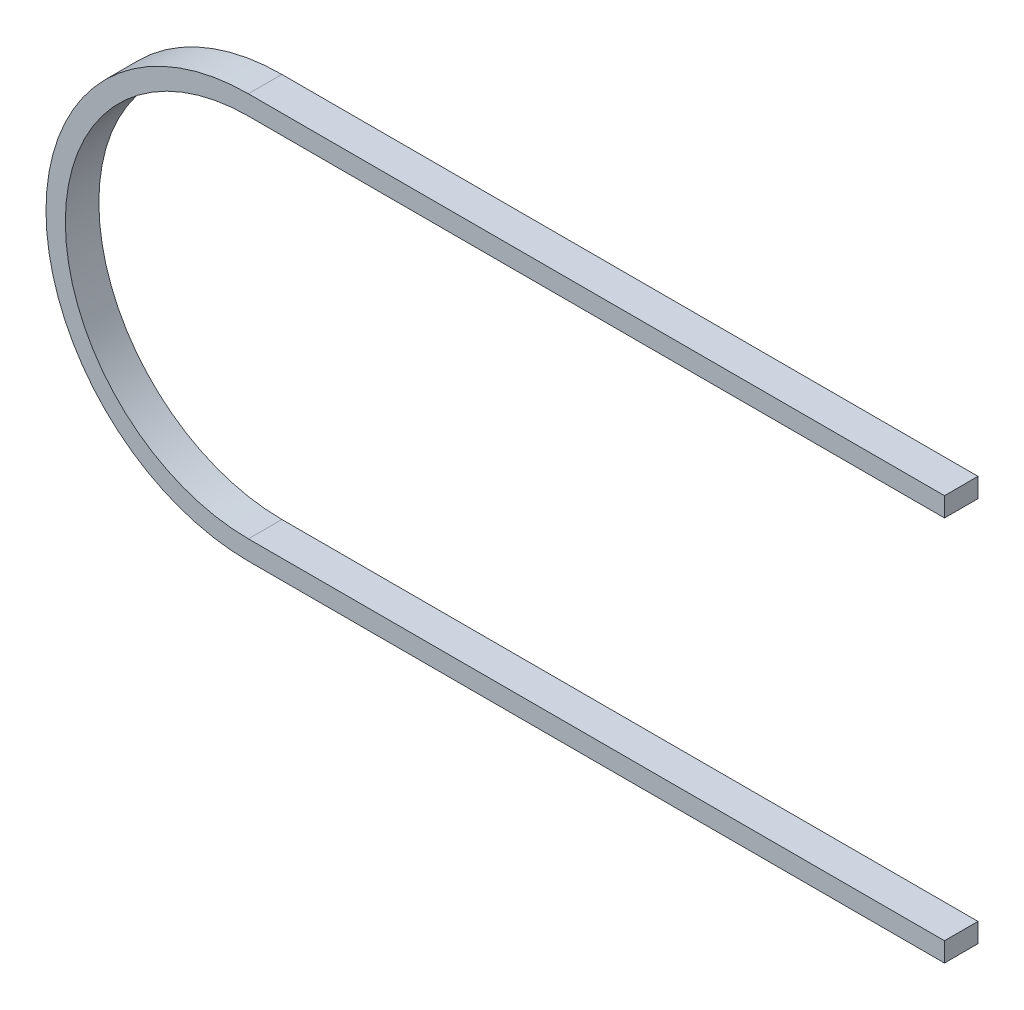
ISO-10303-21;
HEADER;
FILE_DESCRIPTION(('STEP AP214'),'2;1');
FILE_NAME('part.step','',(''),(''),'','','');
FILE_SCHEMA(('AUTOMOTIVE_DESIGN { 1 0 10303 214 1 1 1 1 }'));
ENDSEC;
DATA;
#1=APPLICATION_CONTEXT('core data for automotive mechanical design processes');
#2=APPLICATION_PROTOCOL_DEFINITION('international standard','automotive_design',2000,#1);
#3=PRODUCT_CONTEXT('',#1,'mechanical');
#4=PRODUCT('Part','Part','',(#3));
#5=PRODUCT_RELATED_PRODUCT_CATEGORY('part','',(#4));
#6=PRODUCT_DEFINITION_FORMATION('','',#4);
#7=PRODUCT_DEFINITION_CONTEXT('part definition',#1,'design');
#8=PRODUCT_DEFINITION('design','',#6,#7);
#9=PRODUCT_DEFINITION_SHAPE('','',#8);
#10=(LENGTH_UNIT() NAMED_UNIT(*) SI_UNIT(.MILLI.,.METRE.));
#11=(NAMED_UNIT(*) PLANE_ANGLE_UNIT() SI_UNIT($,.RADIAN.));
#12=(NAMED_UNIT(*) SI_UNIT($,.STERADIAN.) SOLID_ANGLE_UNIT());
#13=UNCERTAINTY_MEASURE_WITH_UNIT(LENGTH_MEASURE(1.E-05),#10,'distance_accuracy_value','');
#14=(GEOMETRIC_REPRESENTATION_CONTEXT(3) GLOBAL_UNCERTAINTY_ASSIGNED_CONTEXT((#13)) GLOBAL_UNIT_ASSIGNED_CONTEXT((#10,
#11,#12)) REPRESENTATION_CONTEXT('',''));
#15=CARTESIAN_POINT('',(0.,0.,0.));
#16=DIRECTION('',(0.,0.,1.));
#17=DIRECTION('',(1.,0.,0.));
#18=AXIS2_PLACEMENT_3D('',#15,#16,#17);
#19=CARTESIAN_POINT('',(0.,0.,3.302));
#20=DIRECTION('',(0.,0.,-1.));
#21=DIRECTION('',(-1.,0.,0.));
#22=AXIS2_PLACEMENT_3D('',#19,#20,#21);
#23=CYLINDRICAL_SURFACE('',#22,19.939);
#24=CARTESIAN_POINT('',(0.,0.,0.));
#25=DIRECTION('',(0.,0.,1.));
#26=DIRECTION('',(1.,0.,0.));
#27=AXIS2_PLACEMENT_3D('',#24,#25,#26);
#28=CIRCLE('',#27,19.939);
#29=CARTESIAN_POINT('',(0.,19.939,0.));
#30=VERTEX_POINT('',#29);
#31=CARTESIAN_POINT('',(0.,-19.939,0.));
#32=VERTEX_POINT('',#31);
#33=EDGE_CURVE('E129',#30,#32,#28,.T.);
#34=ORIENTED_EDGE('',*,*,#33,.T.);
#35=DIRECTION('',(0.,0.,-1.));
#36=VECTOR('',#35,1.);
#37=CARTESIAN_POINT('',(0.,-19.939,3.302));
#38=LINE('',#37,#36);
#39=CARTESIAN_POINT('',(0.,-19.939,3.302));
#40=VERTEX_POINT('',#39);
#41=EDGE_CURVE('E11',#40,#32,#38,.T.);
#42=ORIENTED_EDGE('',*,*,#41,.F.);
#43=CARTESIAN_POINT('',(0.,0.,3.302));
#44=DIRECTION('',(0.,0.,1.));
#45=DIRECTION('',(1.,0.,0.));
#46=AXIS2_PLACEMENT_3D('',#43,#44,#45);
#47=CIRCLE('',#46,19.939);
#48=CARTESIAN_POINT('',(0.,19.939,3.302));
#49=VERTEX_POINT('',#48);
#50=EDGE_CURVE('E143',#49,#40,#47,.T.);
#51=ORIENTED_EDGE('',*,*,#50,.F.);
#52=DIRECTION('',(0.,0.,-1.));
#53=VECTOR('',#52,1.);
#54=CARTESIAN_POINT('',(0.,19.939,3.302));
#55=LINE('',#54,#53);
#56=EDGE_CURVE('E125',#49,#30,#55,.T.);
#57=ORIENTED_EDGE('',*,*,#56,.T.);
#58=EDGE_LOOP('',(#34,#42,#51,#57));
#59=FACE_BOUND('',#58,.T.);
#60=ADVANCED_FACE('F33',(#59),#23,.T.);
#61=CARTESIAN_POINT('',(68.58,-19.939,3.302));
#62=DIRECTION('',(0.,1.,0.));
#63=DIRECTION('',(0.,0.,1.));
#64=AXIS2_PLACEMENT_3D('',#61,#62,#63);
#65=PLANE('',#64);
#66=DIRECTION('',(1.,0.,0.));
#67=VECTOR('',#66,1.);
#68=CARTESIAN_POINT('',(68.58,-19.939,0.));
#69=LINE('',#68,#67);
#70=CARTESIAN_POINT('',(68.58,-19.939,0.));
#71=VERTEX_POINT('',#70);
#72=EDGE_CURVE('E132',#32,#71,#69,.T.);
#73=ORIENTED_EDGE('',*,*,#72,.T.);
#74=DIRECTION('',(0.,0.,-1.));
#75=VECTOR('',#74,1.);
#76=CARTESIAN_POINT('',(68.58,-19.939,3.302));
#77=LINE('',#76,#75);
#78=CARTESIAN_POINT('',(68.58,-19.939,3.302));
#79=VERTEX_POINT('',#78);
#80=EDGE_CURVE('E41',#79,#71,#77,.T.);
#81=ORIENTED_EDGE('',*,*,#80,.F.);
#82=DIRECTION('',(1.,0.,0.));
#83=VECTOR('',#82,1.);
#84=CARTESIAN_POINT('',(68.58,-19.939,3.302));
#85=LINE('',#84,#83);
#86=EDGE_CURVE('E92',#40,#79,#85,.T.);
#87=ORIENTED_EDGE('',*,*,#86,.F.);
#88=ORIENTED_EDGE('',*,*,#41,.T.);
#89=EDGE_LOOP('',(#73,#81,#87,#88));
#90=FACE_BOUND('',#89,.T.);
#91=ADVANCED_FACE('F178',(#90),#65,.F.);
#92=CARTESIAN_POINT('',(68.58,-18.034,3.302));
#93=DIRECTION('',(-1.,0.,0.));
#94=DIRECTION('',(0.,0.,1.));
#95=AXIS2_PLACEMENT_3D('',#92,#93,#94);
#96=PLANE('',#95);
#97=DIRECTION('',(0.,1.,0.));
#98=VECTOR('',#97,1.);
#99=CARTESIAN_POINT('',(68.58,-18.034,0.));
#100=LINE('',#99,#98);
#101=CARTESIAN_POINT('',(68.58,-18.034,0.));
#102=VERTEX_POINT('',#101);
#103=EDGE_CURVE('E134',#71,#102,#100,.T.);
#104=ORIENTED_EDGE('',*,*,#103,.T.);
#105=DIRECTION('',(0.,0.,-1.));
#106=VECTOR('',#105,1.);
#107=CARTESIAN_POINT('',(68.58,-18.034,3.302));
#108=LINE('',#107,#106);
#109=CARTESIAN_POINT('',(68.58,-18.034,3.302));
#110=VERTEX_POINT('',#109);
#111=EDGE_CURVE('E150',#110,#102,#108,.T.);
#112=ORIENTED_EDGE('',*,*,#111,.F.);
#113=DIRECTION('',(0.,1.,0.));
#114=VECTOR('',#113,1.);
#115=CARTESIAN_POINT('',(68.58,-18.034,3.302));
#116=LINE('',#115,#114);
#117=EDGE_CURVE('E158',#79,#110,#116,.T.);
#118=ORIENTED_EDGE('',*,*,#117,.F.);
#119=ORIENTED_EDGE('',*,*,#80,.T.);
#120=EDGE_LOOP('',(#104,#112,#118,#119));
#121=FACE_BOUND('',#120,.T.);
#122=ADVANCED_FACE('F156',(#121),#96,.F.);
#123=CARTESIAN_POINT('',(0.,-18.034,3.302));
#124=DIRECTION('',(0.,-1.,0.));
#125=DIRECTION('',(1.,0.,0.));
#126=AXIS2_PLACEMENT_3D('',#123,#124,#125);
#127=PLANE('',#126);
#128=DIRECTION('',(-1.,0.,0.));
#129=VECTOR('',#128,1.);
#130=CARTESIAN_POINT('',(0.,-18.034,0.));
#131=LINE('',#130,#129);
#132=CARTESIAN_POINT('',(0.,-18.034,0.));
#133=VERTEX_POINT('',#132);
#134=EDGE_CURVE('E136',#102,#133,#131,.T.);
#135=ORIENTED_EDGE('',*,*,#134,.T.);
#136=DIRECTION('',(0.,0.,-1.));
#137=VECTOR('',#136,1.);
#138=CARTESIAN_POINT('',(0.,-18.034,3.302));
#139=LINE('',#138,#137);
#140=CARTESIAN_POINT('',(0.,-18.034,3.302));
#141=VERTEX_POINT('',#140);
#142=EDGE_CURVE('E147',#141,#133,#139,.T.);
#143=ORIENTED_EDGE('',*,*,#142,.F.);
#144=DIRECTION('',(-1.,0.,0.));
#145=VECTOR('',#144,1.);
#146=CARTESIAN_POINT('',(0.,-18.034,3.302));
#147=LINE('',#146,#145);
#148=EDGE_CURVE('E170',#110,#141,#147,.T.);
#149=ORIENTED_EDGE('',*,*,#148,.F.);
#150=ORIENTED_EDGE('',*,*,#111,.T.);
#151=EDGE_LOOP('',(#135,#143,#149,#150));
#152=FACE_BOUND('',#151,.T.);
#153=ADVANCED_FACE('F166',(#152),#127,.F.);
#154=CARTESIAN_POINT('',(0.,0.,3.302));
#155=DIRECTION('',(0.,0.,-1.));
#156=DIRECTION('',(-1.,0.,0.));
#157=AXIS2_PLACEMENT_3D('',#154,#155,#156);
#158=CYLINDRICAL_SURFACE('',#157,18.034);
#159=CARTESIAN_POINT('',(0.,0.,0.));
#160=DIRECTION('',(0.,0.,-1.));
#161=DIRECTION('',(1.,0.,0.));
#162=AXIS2_PLACEMENT_3D('',#159,#160,#161);
#163=CIRCLE('',#162,18.034);
#164=CARTESIAN_POINT('',(0.,18.034,0.));
#165=VERTEX_POINT('',#164);
#166=EDGE_CURVE('E138',#133,#165,#163,.T.);
#167=ORIENTED_EDGE('',*,*,#166,.T.);
#168=DIRECTION('',(0.,0.,-1.));
#169=VECTOR('',#168,1.);
#170=CARTESIAN_POINT('',(0.,18.034,3.302));
#171=LINE('',#170,#169);
#172=CARTESIAN_POINT('',(0.,18.034,3.302));
#173=VERTEX_POINT('',#172);
#174=EDGE_CURVE('E120',#173,#165,#171,.T.);
#175=ORIENTED_EDGE('',*,*,#174,.F.);
#176=CARTESIAN_POINT('',(0.,0.,3.302));
#177=DIRECTION('',(0.,0.,-1.));
#178=DIRECTION('',(1.,0.,0.));
#179=AXIS2_PLACEMENT_3D('',#176,#177,#178);
#180=CIRCLE('',#179,18.034);
#181=EDGE_CURVE('E111',#141,#173,#180,.T.);
#182=ORIENTED_EDGE('',*,*,#181,.F.);
#183=ORIENTED_EDGE('',*,*,#142,.T.);
#184=EDGE_LOOP('',(#167,#175,#182,#183));
#185=FACE_BOUND('',#184,.T.);
#186=ADVANCED_FACE('F169',(#185),#158,.F.);
#187=CARTESIAN_POINT('',(0.,18.034,3.302));
#188=DIRECTION('',(0.,1.,0.));
#189=DIRECTION('',(0.,0.,1.));
#190=AXIS2_PLACEMENT_3D('',#187,#188,#189);
#191=PLANE('',#190);
#192=DIRECTION('',(1.,0.,0.));
#193=VECTOR('',#192,1.);
#194=CARTESIAN_POINT('',(0.,18.034,0.));
#195=LINE('',#194,#193);
#196=CARTESIAN_POINT('',(68.58,18.034,0.));
#197=VERTEX_POINT('',#196);
#198=EDGE_CURVE('E119',#165,#197,#195,.T.);
#199=ORIENTED_EDGE('',*,*,#198,.T.);
#200=DIRECTION('',(0.,0.,-1.));
#201=VECTOR('',#200,1.);
#202=CARTESIAN_POINT('',(68.58,18.034,3.302));
#203=LINE('',#202,#201);
#204=CARTESIAN_POINT('',(68.58,18.034,3.302));
#205=VERTEX_POINT('',#204);
#206=EDGE_CURVE('E116',#205,#197,#203,.T.);
#207=ORIENTED_EDGE('',*,*,#206,.F.);
#208=DIRECTION('',(1.,0.,0.));
#209=VECTOR('',#208,1.);
#210=CARTESIAN_POINT('',(0.,18.034,3.302));
#211=LINE('',#210,#209);
#212=EDGE_CURVE('E105',#173,#205,#211,.T.);
#213=ORIENTED_EDGE('',*,*,#212,.F.);
#214=ORIENTED_EDGE('',*,*,#174,.T.);
#215=EDGE_LOOP('',(#199,#207,#213,#214));
#216=FACE_BOUND('',#215,.T.);
#217=ADVANCED_FACE('F117',(#216),#191,.F.);
#218=CARTESIAN_POINT('',(68.58,18.034,3.302));
#219=DIRECTION('',(-1.,0.,0.));
#220=DIRECTION('',(0.,0.,1.));
#221=AXIS2_PLACEMENT_3D('',#218,#219,#220);
#222=PLANE('',#221);
#223=DIRECTION('',(0.,1.,0.));
#224=VECTOR('',#223,1.);
#225=CARTESIAN_POINT('',(68.58,18.034,0.));
#226=LINE('',#225,#224);
#227=CARTESIAN_POINT('',(68.58,19.939,0.));
#228=VERTEX_POINT('',#227);
#229=EDGE_CURVE('E78',#197,#228,#226,.T.);
#230=ORIENTED_EDGE('',*,*,#229,.T.);
#231=DIRECTION('',(0.,0.,-1.));
#232=VECTOR('',#231,1.);
#233=CARTESIAN_POINT('',(68.58,19.939,3.302));
#234=LINE('',#233,#232);
#235=CARTESIAN_POINT('',(68.58,19.939,3.302));
#236=VERTEX_POINT('',#235);
#237=EDGE_CURVE('E121',#236,#228,#234,.T.);
#238=ORIENTED_EDGE('',*,*,#237,.F.);
#239=DIRECTION('',(0.,1.,0.));
#240=VECTOR('',#239,1.);
#241=CARTESIAN_POINT('',(68.58,18.034,3.302));
#242=LINE('',#241,#240);
#243=EDGE_CURVE('E109',#205,#236,#242,.T.);
#244=ORIENTED_EDGE('',*,*,#243,.F.);
#245=ORIENTED_EDGE('',*,*,#206,.T.);
#246=EDGE_LOOP('',(#230,#238,#244,#245));
#247=FACE_BOUND('',#246,.T.);
#248=ADVANCED_FACE('F123',(#247),#222,.F.);
#249=CARTESIAN_POINT('',(0.,19.939,3.302));
#250=DIRECTION('',(0.,-1.,0.));
#251=DIRECTION('',(0.,0.,-1.));
#252=AXIS2_PLACEMENT_3D('',#249,#250,#251);
#253=PLANE('',#252);
#254=DIRECTION('',(-1.,0.,0.));
#255=VECTOR('',#254,1.);
#256=CARTESIAN_POINT('',(0.,19.939,0.));
#257=LINE('',#256,#255);
#258=EDGE_CURVE('E84',#228,#30,#257,.T.);
#259=ORIENTED_EDGE('',*,*,#258,.T.);
#260=ORIENTED_EDGE('',*,*,#56,.F.);
#261=DIRECTION('',(-1.,0.,0.));
#262=VECTOR('',#261,1.);
#263=CARTESIAN_POINT('',(0.,19.939,3.302));
#264=LINE('',#263,#262);
#265=EDGE_CURVE('E49',#236,#49,#264,.T.);
#266=ORIENTED_EDGE('',*,*,#265,.F.);
#267=ORIENTED_EDGE('',*,*,#237,.T.);
#268=EDGE_LOOP('',(#259,#260,#266,#267));
#269=FACE_BOUND('',#268,.T.);
#270=ADVANCED_FACE('F194',(#269),#253,.F.);
#271=CARTESIAN_POINT('',(0.,0.,3.302));
#272=DIRECTION('',(0.,0.,1.));
#273=DIRECTION('',(1.,0.,0.));
#274=AXIS2_PLACEMENT_3D('',#271,#272,#273);
#275=PLANE('',#274);
#276=ORIENTED_EDGE('',*,*,#50,.T.);
#277=ORIENTED_EDGE('',*,*,#86,.T.);
#278=ORIENTED_EDGE('',*,*,#117,.T.);
#279=ORIENTED_EDGE('',*,*,#148,.T.);
#280=ORIENTED_EDGE('',*,*,#181,.T.);
#281=ORIENTED_EDGE('',*,*,#212,.T.);
#282=ORIENTED_EDGE('',*,*,#243,.T.);
#283=ORIENTED_EDGE('',*,*,#265,.T.);
#284=EDGE_LOOP('',(#276,#277,#278,#279,#280,#281,#282,#283));
#285=FACE_BOUND('',#284,.T.);
#286=ADVANCED_FACE('F107',(#285),#275,.T.);
#287=CARTESIAN_POINT('',(0.,0.,0.));
#288=DIRECTION('',(0.,0.,1.));
#289=DIRECTION('',(1.,0.,0.));
#290=AXIS2_PLACEMENT_3D('',#287,#288,#289);
#291=PLANE('',#290);
#292=ORIENTED_EDGE('',*,*,#33,.F.);
#293=ORIENTED_EDGE('',*,*,#258,.F.);
#294=ORIENTED_EDGE('',*,*,#229,.F.);
#295=ORIENTED_EDGE('',*,*,#198,.F.);
#296=ORIENTED_EDGE('',*,*,#166,.F.);
#297=ORIENTED_EDGE('',*,*,#134,.F.);
#298=ORIENTED_EDGE('',*,*,#103,.F.);
#299=ORIENTED_EDGE('',*,*,#72,.F.);
#300=EDGE_LOOP('',(#292,#293,#294,#295,#296,#297,#298,#299));
#301=FACE_BOUND('',#300,.T.);
#302=ADVANCED_FACE('F162',(#301),#291,.F.);
#303=CLOSED_SHELL('',(#60,#91,#122,#153,#186,#217,#248,#270,#286,#302));
#304=MANIFOLD_SOLID_BREP('B2',#303);
#305=ADVANCED_BREP_SHAPE_REPRESENTATION('',(#18,#304),#14);
#306=SHAPE_DEFINITION_REPRESENTATION(#9,#305);
ENDSEC;
END-ISO-10303-21;
